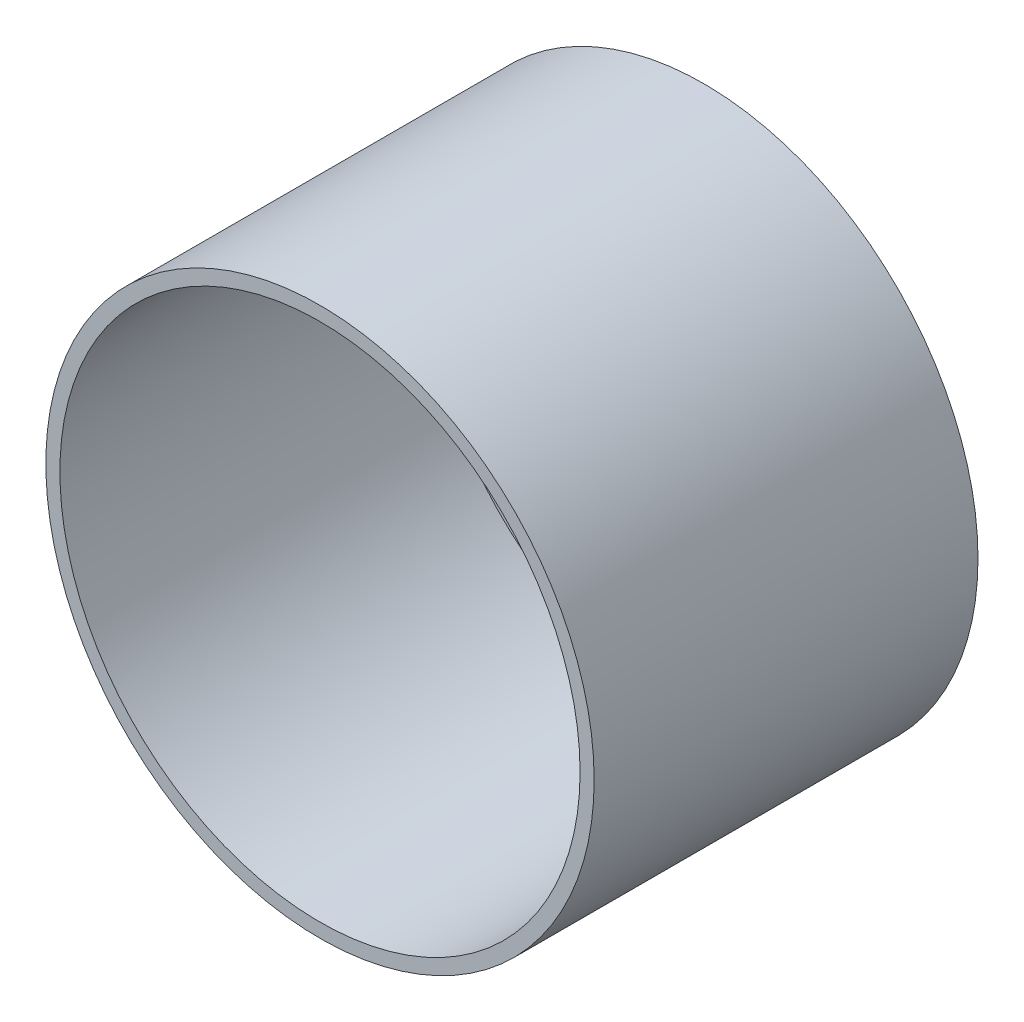
ISO-10303-21;
HEADER;
FILE_DESCRIPTION(('STEP AP214'),'2;1');
FILE_NAME('part.step','',(''),(''),'','','');
FILE_SCHEMA(('AUTOMOTIVE_DESIGN { 1 0 10303 214 1 1 1 1 }'));
ENDSEC;
DATA;
#1=APPLICATION_CONTEXT('core data for automotive mechanical design processes');
#2=APPLICATION_PROTOCOL_DEFINITION('international standard','automotive_design',2000,#1);
#3=PRODUCT_CONTEXT('',#1,'mechanical');
#4=PRODUCT('Part','Part','',(#3));
#5=PRODUCT_RELATED_PRODUCT_CATEGORY('part','',(#4));
#6=PRODUCT_DEFINITION_FORMATION('','',#4);
#7=PRODUCT_DEFINITION_CONTEXT('part definition',#1,'design');
#8=PRODUCT_DEFINITION('design','',#6,#7);
#9=PRODUCT_DEFINITION_SHAPE('','',#8);
#10=(LENGTH_UNIT() NAMED_UNIT(*) SI_UNIT(.MILLI.,.METRE.));
#11=(NAMED_UNIT(*) PLANE_ANGLE_UNIT() SI_UNIT($,.RADIAN.));
#12=(NAMED_UNIT(*) SI_UNIT($,.STERADIAN.) SOLID_ANGLE_UNIT());
#13=UNCERTAINTY_MEASURE_WITH_UNIT(LENGTH_MEASURE(1.E-05),#10,'distance_accuracy_value','');
#14=(GEOMETRIC_REPRESENTATION_CONTEXT(3) GLOBAL_UNCERTAINTY_ASSIGNED_CONTEXT((#13)) GLOBAL_UNIT_ASSIGNED_CONTEXT((#10,
#11,#12)) REPRESENTATION_CONTEXT('',''));
#15=CARTESIAN_POINT('',(0.,0.,0.));
#16=DIRECTION('',(0.,0.,1.));
#17=DIRECTION('',(1.,0.,0.));
#18=AXIS2_PLACEMENT_3D('',#15,#16,#17);
#19=CARTESIAN_POINT('',(0.,0.,5.));
#20=DIRECTION('',(0.,0.,-1.));
#21=DIRECTION('',(-1.,0.,0.));
#22=AXIS2_PLACEMENT_3D('',#19,#20,#21);
#23=CYLINDRICAL_SURFACE('',#22,75.);
#24=CARTESIAN_POINT('',(0.,0.,0.));
#25=DIRECTION('',(0.,0.,1.));
#26=DIRECTION('',(1.,0.,0.));
#27=AXIS2_PLACEMENT_3D('',#24,#25,#26);
#28=CIRCLE('',#27,75.);
#29=CARTESIAN_POINT('',(75.,0.,0.));
#30=VERTEX_POINT('',#29);
#31=EDGE_CURVE('E44',#30,#30,#28,.T.);
#32=ORIENTED_EDGE('',*,*,#31,.T.);
#33=EDGE_LOOP('',(#32));
#34=FACE_BOUND('',#33,.T.);
#35=CARTESIAN_POINT('',(0.,0.,105.));
#36=DIRECTION('',(0.,0.,1.));
#37=DIRECTION('',(1.,0.,0.));
#38=AXIS2_PLACEMENT_3D('',#35,#36,#37);
#39=CIRCLE('',#38,75.);
#40=CARTESIAN_POINT('',(75.,0.,105.));
#41=VERTEX_POINT('',#40);
#42=EDGE_CURVE('E49',#41,#41,#39,.T.);
#43=ORIENTED_EDGE('',*,*,#42,.F.);
#44=EDGE_LOOP('',(#43));
#45=FACE_BOUND('',#44,.T.);
#46=ADVANCED_FACE('F37',(#34,#45),#23,.T.);
#47=CARTESIAN_POINT('',(0.,0.,0.));
#48=DIRECTION('',(0.,0.,1.));
#49=DIRECTION('',(1.,0.,0.));
#50=AXIS2_PLACEMENT_3D('',#47,#48,#49);
#51=PLANE('',#50);
#52=ORIENTED_EDGE('',*,*,#31,.F.);
#53=EDGE_LOOP('',(#52));
#54=FACE_BOUND('',#53,.T.);
#55=ADVANCED_FACE('F65',(#54),#51,.F.);
#56=CARTESIAN_POINT('',(0.,0.,105.));
#57=DIRECTION('',(0.,0.,1.));
#58=DIRECTION('',(1.,0.,0.));
#59=AXIS2_PLACEMENT_3D('',#56,#57,#58);
#60=PLANE('',#59);
#61=ORIENTED_EDGE('',*,*,#42,.T.);
#62=EDGE_LOOP('',(#61));
#63=FACE_BOUND('',#62,.T.);
#64=CARTESIAN_POINT('',(0.,0.,105.));
#65=DIRECTION('',(0.,0.,1.));
#66=DIRECTION('',(1.,0.,0.));
#67=AXIS2_PLACEMENT_3D('',#64,#65,#66);
#68=CIRCLE('',#67,71.1508490871856);
#69=CARTESIAN_POINT('',(71.1508490871856,0.,105.));
#70=VERTEX_POINT('',#69);
#71=EDGE_CURVE('E54',#70,#70,#68,.T.);
#72=ORIENTED_EDGE('',*,*,#71,.F.);
#73=EDGE_LOOP('',(#72));
#74=FACE_BOUND('',#73,.T.);
#75=ADVANCED_FACE('F63',(#63,#74),#60,.T.);
#76=CARTESIAN_POINT('',(0.,0.,105.));
#77=DIRECTION('',(0.,0.,-1.));
#78=DIRECTION('',(-1.,0.,0.));
#79=AXIS2_PLACEMENT_3D('',#76,#77,#78);
#80=CYLINDRICAL_SURFACE('',#79,71.1508490871856);
#81=ORIENTED_EDGE('',*,*,#71,.T.);
#82=EDGE_LOOP('',(#81));
#83=FACE_BOUND('',#82,.T.);
#84=CARTESIAN_POINT('',(0.,0.,5.));
#85=DIRECTION('',(0.,0.,1.));
#86=DIRECTION('',(1.,0.,0.));
#87=AXIS2_PLACEMENT_3D('',#84,#85,#86);
#88=CIRCLE('',#87,71.1508490871856);
#89=CARTESIAN_POINT('',(71.1508490871856,0.,5.));
#90=VERTEX_POINT('',#89);
#91=EDGE_CURVE('E10',#90,#90,#88,.F.);
#92=ORIENTED_EDGE('',*,*,#91,.T.);
#93=EDGE_LOOP('',(#92));
#94=FACE_BOUND('',#93,.T.);
#95=ADVANCED_FACE('F61',(#83,#94),#80,.F.);
#96=CARTESIAN_POINT('',(0.,0.,5.));
#97=DIRECTION('',(0.,0.,1.));
#98=DIRECTION('',(1.,0.,0.));
#99=AXIS2_PLACEMENT_3D('',#96,#97,#98);
#100=PLANE('',#99);
#101=ORIENTED_EDGE('',*,*,#91,.F.);
#102=EDGE_LOOP('',(#101));
#103=FACE_BOUND('',#102,.T.);
#104=ADVANCED_FACE('F72',(#103),#100,.T.);
#105=CLOSED_SHELL('',(#46,#55,#75,#95,#104));
#106=MANIFOLD_SOLID_BREP('B2',#105);
#107=ADVANCED_BREP_SHAPE_REPRESENTATION('',(#18,#106),#14);
#108=SHAPE_DEFINITION_REPRESENTATION(#9,#107);
ENDSEC;
END-ISO-10303-21;
